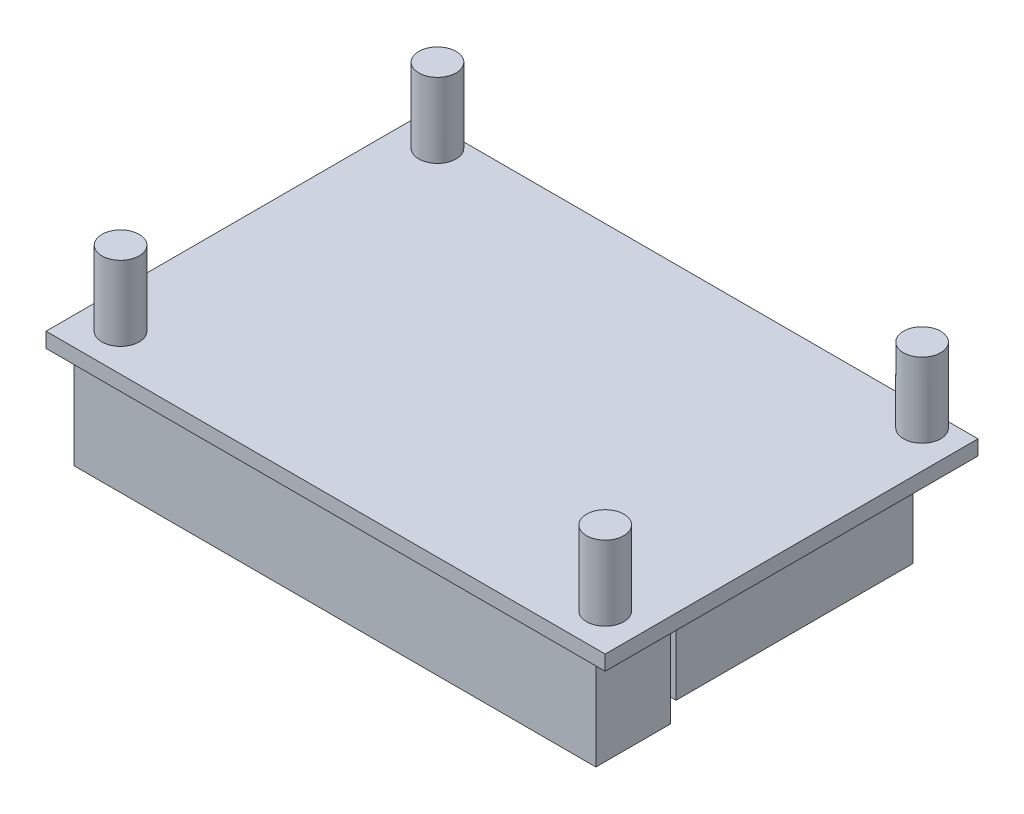
ISO-10303-21;
HEADER;
FILE_DESCRIPTION(('STEP AP214'),'2;1');
FILE_NAME('part.step','',(''),(''),'','','');
FILE_SCHEMA(('AUTOMOTIVE_DESIGN { 1 0 10303 214 1 1 1 1 }'));
ENDSEC;
DATA;
#1=APPLICATION_CONTEXT('core data for automotive mechanical design processes');
#2=APPLICATION_PROTOCOL_DEFINITION('international standard','automotive_design',2000,#1);
#3=PRODUCT_CONTEXT('',#1,'mechanical');
#4=PRODUCT('Part','Part','',(#3));
#5=PRODUCT_RELATED_PRODUCT_CATEGORY('part','',(#4));
#6=PRODUCT_DEFINITION_FORMATION('','',#4);
#7=PRODUCT_DEFINITION_CONTEXT('part definition',#1,'design');
#8=PRODUCT_DEFINITION('design','',#6,#7);
#9=PRODUCT_DEFINITION_SHAPE('','',#8);
#10=(LENGTH_UNIT() NAMED_UNIT(*) SI_UNIT(.MILLI.,.METRE.));
#11=(NAMED_UNIT(*) PLANE_ANGLE_UNIT() SI_UNIT($,.RADIAN.));
#12=(NAMED_UNIT(*) SI_UNIT($,.STERADIAN.) SOLID_ANGLE_UNIT());
#13=UNCERTAINTY_MEASURE_WITH_UNIT(LENGTH_MEASURE(1.E-05),#10,'distance_accuracy_value','');
#14=(GEOMETRIC_REPRESENTATION_CONTEXT(3) GLOBAL_UNCERTAINTY_ASSIGNED_CONTEXT((#13)) GLOBAL_UNIT_ASSIGNED_CONTEXT((#10,
#11,#12)) REPRESENTATION_CONTEXT('',''));
#15=CARTESIAN_POINT('',(0.,0.,0.));
#16=DIRECTION('',(0.,0.,1.));
#17=DIRECTION('',(1.,0.,0.));
#18=AXIS2_PLACEMENT_3D('',#15,#16,#17);
#19=CARTESIAN_POINT('',(0.,12.7,0.));
#20=DIRECTION('',(0.,1.,0.));
#21=DIRECTION('',(0.,0.,1.));
#22=AXIS2_PLACEMENT_3D('',#19,#20,#21);
#23=PLANE('',#22);
#24=DIRECTION('',(0.,0.,1.));
#25=VECTOR('',#24,1.);
#26=CARTESIAN_POINT('',(1.6,12.7,-16.));
#27=LINE('',#26,#25);
#28=CARTESIAN_POINT('',(1.6,12.7,-16.));
#29=VERTEX_POINT('',#28);
#30=CARTESIAN_POINT('',(1.6,12.7,9.4));
#31=VERTEX_POINT('',#30);
#32=EDGE_CURVE('E218',#29,#31,#27,.T.);
#33=ORIENTED_EDGE('',*,*,#32,.T.);
#34=DIRECTION('',(1.,0.,0.));
#35=VECTOR('',#34,1.);
#36=CARTESIAN_POINT('',(1.6,12.7,9.4));
#37=LINE('',#36,#35);
#38=CARTESIAN_POINT('',(27.,12.7,9.4));
#39=VERTEX_POINT('',#38);
#40=EDGE_CURVE('E222',#31,#39,#37,.T.);
#41=ORIENTED_EDGE('',*,*,#40,.T.);
#42=DIRECTION('',(0.,0.,-1.));
#43=VECTOR('',#42,1.);
#44=CARTESIAN_POINT('',(27.,12.7,9.4));
#45=LINE('',#44,#43);
#46=CARTESIAN_POINT('',(27.,12.7,-16.));
#47=VERTEX_POINT('',#46);
#48=EDGE_CURVE('E221',#39,#47,#45,.T.);
#49=ORIENTED_EDGE('',*,*,#48,.T.);
#50=DIRECTION('',(-1.,0.,0.));
#51=VECTOR('',#50,1.);
#52=CARTESIAN_POINT('',(27.,12.7,-16.));
#53=LINE('',#52,#51);
#54=EDGE_CURVE('E228',#47,#29,#53,.T.);
#55=ORIENTED_EDGE('',*,*,#54,.T.);
#56=EDGE_LOOP('',(#33,#41,#49,#55));
#57=FACE_BOUND('',#56,.T.);
#58=DIRECTION('',(-1.,0.,0.));
#59=VECTOR('',#58,1.);
#60=CARTESIAN_POINT('',(-5.1,12.7,-16.));
#61=LINE('',#60,#59);
#62=CARTESIAN_POINT('',(-5.1,12.7,-16.));
#63=VERTEX_POINT('',#62);
#64=CARTESIAN_POINT('',(-28.,12.7,-16.));
#65=VERTEX_POINT('',#64);
#66=EDGE_CURVE('E292',#63,#65,#61,.T.);
#67=ORIENTED_EDGE('',*,*,#66,.T.);
#68=DIRECTION('',(0.,0.,1.));
#69=VECTOR('',#68,1.);
#70=CARTESIAN_POINT('',(-28.,12.7,-16.));
#71=LINE('',#70,#69);
#72=CARTESIAN_POINT('',(-28.,12.7,7.));
#73=VERTEX_POINT('',#72);
#74=EDGE_CURVE('E283',#65,#73,#71,.T.);
#75=ORIENTED_EDGE('',*,*,#74,.T.);
#76=DIRECTION('',(1.,0.,0.));
#77=VECTOR('',#76,1.);
#78=CARTESIAN_POINT('',(-28.,12.7,7.));
#79=LINE('',#78,#77);
#80=CARTESIAN_POINT('',(-5.1,12.7,7.));
#81=VERTEX_POINT('',#80);
#82=EDGE_CURVE('E285',#73,#81,#79,.T.);
#83=ORIENTED_EDGE('',*,*,#82,.T.);
#84=DIRECTION('',(0.,0.,-1.));
#85=VECTOR('',#84,1.);
#86=CARTESIAN_POINT('',(-5.1,12.7,7.));
#87=LINE('',#86,#85);
#88=EDGE_CURVE('E288',#81,#63,#87,.T.);
#89=ORIENTED_EDGE('',*,*,#88,.T.);
#90=EDGE_LOOP('',(#67,#75,#83,#89));
#91=FACE_BOUND('',#90,.T.);
#92=DIRECTION('',(0.,0.,1.));
#93=VECTOR('',#92,1.);
#94=CARTESIAN_POINT('',(-30.,12.7,-20.));
#95=LINE('',#94,#93);
#96=CARTESIAN_POINT('',(-30.,12.7,-20.));
#97=VERTEX_POINT('',#96);
#98=CARTESIAN_POINT('',(-30.,12.7,20.));
#99=VERTEX_POINT('',#98);
#100=EDGE_CURVE('E327',#97,#99,#95,.T.);
#101=ORIENTED_EDGE('',*,*,#100,.F.);
#102=DIRECTION('',(-1.,0.,0.));
#103=VECTOR('',#102,1.);
#104=CARTESIAN_POINT('',(30.,12.7,-20.));
#105=LINE('',#104,#103);
#106=CARTESIAN_POINT('',(30.,12.7,-20.));
#107=VERTEX_POINT('',#106);
#108=EDGE_CURVE('E333',#107,#97,#105,.T.);
#109=ORIENTED_EDGE('',*,*,#108,.F.);
#110=DIRECTION('',(0.,0.,-1.));
#111=VECTOR('',#110,1.);
#112=CARTESIAN_POINT('',(30.,12.7,20.));
#113=LINE('',#112,#111);
#114=CARTESIAN_POINT('',(30.,12.7,20.));
#115=VERTEX_POINT('',#114);
#116=EDGE_CURVE('E349',#115,#107,#113,.T.);
#117=ORIENTED_EDGE('',*,*,#116,.F.);
#118=DIRECTION('',(1.,0.,0.));
#119=VECTOR('',#118,1.);
#120=CARTESIAN_POINT('',(-30.,12.7,20.));
#121=LINE('',#120,#119);
#122=EDGE_CURVE('E350',#99,#115,#121,.T.);
#123=ORIENTED_EDGE('',*,*,#122,.F.);
#124=EDGE_LOOP('',(#101,#109,#117,#123));
#125=FACE_BOUND('',#124,.T.);
#126=DIRECTION('',(0.,0.,1.));
#127=VECTOR('',#126,1.);
#128=CARTESIAN_POINT('',(-28.,12.7,11.));
#129=LINE('',#128,#127);
#130=CARTESIAN_POINT('',(-28.,12.7,11.));
#131=VERTEX_POINT('',#130);
#132=CARTESIAN_POINT('',(-28.,12.7,19.));
#133=VERTEX_POINT('',#132);
#134=EDGE_CURVE('E59',#131,#133,#129,.T.);
#135=ORIENTED_EDGE('',*,*,#134,.T.);
#136=DIRECTION('',(1.,0.,0.));
#137=VECTOR('',#136,1.);
#138=CARTESIAN_POINT('',(-28.,12.7,19.));
#139=LINE('',#138,#137);
#140=CARTESIAN_POINT('',(28.,12.7,19.));
#141=VERTEX_POINT('',#140);
#142=EDGE_CURVE('E64',#133,#141,#139,.T.);
#143=ORIENTED_EDGE('',*,*,#142,.T.);
#144=DIRECTION('',(0.,0.,-1.));
#145=VECTOR('',#144,1.);
#146=CARTESIAN_POINT('',(28.,12.7,19.));
#147=LINE('',#146,#145);
#148=CARTESIAN_POINT('',(28.,12.7,11.));
#149=VERTEX_POINT('',#148);
#150=EDGE_CURVE('E185',#141,#149,#147,.T.);
#151=ORIENTED_EDGE('',*,*,#150,.T.);
#152=DIRECTION('',(-1.,0.,0.));
#153=VECTOR('',#152,1.);
#154=CARTESIAN_POINT('',(28.,12.7,11.));
#155=LINE('',#154,#153);
#156=EDGE_CURVE('E183',#149,#131,#155,.T.);
#157=ORIENTED_EDGE('',*,*,#156,.T.);
#158=EDGE_LOOP('',(#135,#143,#151,#157));
#159=FACE_BOUND('',#158,.T.);
#160=ADVANCED_FACE('F43',(#57,#91,#125,#159),#23,.F.);
#161=CARTESIAN_POINT('',(-26.,22.3,-18.));
#162=DIRECTION('',(0.,-1.,0.));
#163=DIRECTION('',(0.,0.,-1.));
#164=AXIS2_PLACEMENT_3D('',#161,#162,#163);
#165=CYLINDRICAL_SURFACE('',#164,2.);
#166=CARTESIAN_POINT('',(-26.,22.3,-18.));
#167=DIRECTION('',(0.,1.,0.));
#168=DIRECTION('',(0.,0.,1.));
#169=AXIS2_PLACEMENT_3D('',#166,#167,#168);
#170=CIRCLE('',#169,2.);
#171=CARTESIAN_POINT('',(-26.,22.3,-16.));
#172=VERTEX_POINT('',#171);
#173=EDGE_CURVE('E11',#172,#172,#170,.T.);
#174=ORIENTED_EDGE('',*,*,#173,.F.);
#175=EDGE_LOOP('',(#174));
#176=FACE_BOUND('',#175,.T.);
#177=CARTESIAN_POINT('',(-26.,14.3,-18.));
#178=DIRECTION('',(0.,1.,0.));
#179=DIRECTION('',(0.,0.,1.));
#180=AXIS2_PLACEMENT_3D('',#177,#178,#179);
#181=CIRCLE('',#180,2.);
#182=CARTESIAN_POINT('',(-26.,14.3,-20.));
#183=VERTEX_POINT('',#182);
#184=EDGE_CURVE('E50',#183,#183,#181,.T.);
#185=ORIENTED_EDGE('',*,*,#184,.T.);
#186=EDGE_LOOP('',(#185));
#187=FACE_BOUND('',#186,.T.);
#188=ADVANCED_FACE('F44',(#176,#187),#165,.T.);
#189=CARTESIAN_POINT('',(-26.,22.3,-18.));
#190=DIRECTION('',(0.,1.,0.));
#191=DIRECTION('',(0.,0.,1.));
#192=AXIS2_PLACEMENT_3D('',#189,#190,#191);
#193=PLANE('',#192);
#194=ORIENTED_EDGE('',*,*,#173,.T.);
#195=EDGE_LOOP('',(#194));
#196=FACE_BOUND('',#195,.T.);
#197=ADVANCED_FACE('F391',(#196),#193,.T.);
#198=CARTESIAN_POINT('',(0.,14.3,0.));
#199=DIRECTION('',(0.,1.,0.));
#200=DIRECTION('',(0.,0.,1.));
#201=AXIS2_PLACEMENT_3D('',#198,#199,#200);
#202=PLANE('',#201);
#203=CARTESIAN_POINT('',(26.,14.3,16.));
#204=DIRECTION('',(0.,1.,0.));
#205=DIRECTION('',(0.,0.,1.));
#206=AXIS2_PLACEMENT_3D('',#203,#204,#205);
#207=CIRCLE('',#206,2.);
#208=CARTESIAN_POINT('',(26.,14.3,18.));
#209=VERTEX_POINT('',#208);
#210=EDGE_CURVE('E311',#209,#209,#207,.T.);
#211=ORIENTED_EDGE('',*,*,#210,.F.);
#212=EDGE_LOOP('',(#211));
#213=FACE_BOUND('',#212,.T.);
#214=CARTESIAN_POINT('',(-26.,14.3,16.));
#215=DIRECTION('',(0.,1.,0.));
#216=DIRECTION('',(0.,0.,1.));
#217=AXIS2_PLACEMENT_3D('',#214,#215,#216);
#218=CIRCLE('',#217,2.);
#219=CARTESIAN_POINT('',(-26.,14.3,18.));
#220=VERTEX_POINT('',#219);
#221=EDGE_CURVE('E323',#220,#220,#218,.T.);
#222=ORIENTED_EDGE('',*,*,#221,.F.);
#223=EDGE_LOOP('',(#222));
#224=FACE_BOUND('',#223,.T.);
#225=DIRECTION('',(-1.,0.,0.));
#226=VECTOR('',#225,1.);
#227=CARTESIAN_POINT('',(30.,14.3,-20.));
#228=LINE('',#227,#226);
#229=CARTESIAN_POINT('',(30.,14.3,-20.));
#230=VERTEX_POINT('',#229);
#231=CARTESIAN_POINT('',(26.,14.3,-20.));
#232=VERTEX_POINT('',#231);
#233=EDGE_CURVE('E336',#230,#232,#228,.T.);
#234=ORIENTED_EDGE('',*,*,#233,.T.);
#235=CARTESIAN_POINT('',(26.,14.3,-18.));
#236=DIRECTION('',(0.,1.,0.));
#237=DIRECTION('',(0.,0.,1.));
#238=AXIS2_PLACEMENT_3D('',#235,#236,#237);
#239=CIRCLE('',#238,2.);
#240=EDGE_CURVE('E320',#232,#232,#239,.T.);
#241=ORIENTED_EDGE('',*,*,#240,.F.);
#242=EDGE_CURVE('E344',#232,#183,#228,.T.);
#243=ORIENTED_EDGE('',*,*,#242,.T.);
#244=ORIENTED_EDGE('',*,*,#184,.F.);
#245=CARTESIAN_POINT('',(-30.,14.3,-20.));
#246=VERTEX_POINT('',#245);
#247=EDGE_CURVE('E340',#183,#246,#228,.T.);
#248=ORIENTED_EDGE('',*,*,#247,.T.);
#249=DIRECTION('',(0.,0.,1.));
#250=VECTOR('',#249,1.);
#251=CARTESIAN_POINT('',(-30.,14.3,-20.));
#252=LINE('',#251,#250);
#253=CARTESIAN_POINT('',(-30.,14.3,20.));
#254=VERTEX_POINT('',#253);
#255=EDGE_CURVE('E332',#246,#254,#252,.T.);
#256=ORIENTED_EDGE('',*,*,#255,.T.);
#257=DIRECTION('',(1.,0.,0.));
#258=VECTOR('',#257,1.);
#259=CARTESIAN_POINT('',(-30.,14.3,20.));
#260=LINE('',#259,#258);
#261=CARTESIAN_POINT('',(30.,14.3,20.));
#262=VERTEX_POINT('',#261);
#263=EDGE_CURVE('E331',#254,#262,#260,.T.);
#264=ORIENTED_EDGE('',*,*,#263,.T.);
#265=DIRECTION('',(0.,0.,-1.));
#266=VECTOR('',#265,1.);
#267=CARTESIAN_POINT('',(30.,14.3,20.));
#268=LINE('',#267,#266);
#269=EDGE_CURVE('E339',#262,#230,#268,.T.);
#270=ORIENTED_EDGE('',*,*,#269,.T.);
#271=EDGE_LOOP('',(#234,#241,#243,#244,#248,#256,#264,#270));
#272=FACE_BOUND('',#271,.T.);
#273=ADVANCED_FACE('F366',(#213,#224,#272),#202,.T.);
#274=CARTESIAN_POINT('',(-30.,14.3,-20.));
#275=DIRECTION('',(1.,0.,0.));
#276=DIRECTION('',(0.,0.,-1.));
#277=AXIS2_PLACEMENT_3D('',#274,#275,#276);
#278=PLANE('',#277);
#279=ORIENTED_EDGE('',*,*,#100,.T.);
#280=DIRECTION('',(0.,-1.,0.));
#281=VECTOR('',#280,1.);
#282=CARTESIAN_POINT('',(-30.,14.3,20.));
#283=LINE('',#282,#281);
#284=EDGE_CURVE('E356',#254,#99,#283,.T.);
#285=ORIENTED_EDGE('',*,*,#284,.F.);
#286=ORIENTED_EDGE('',*,*,#255,.F.);
#287=DIRECTION('',(0.,-1.,0.));
#288=VECTOR('',#287,1.);
#289=CARTESIAN_POINT('',(-30.,14.3,-20.));
#290=LINE('',#289,#288);
#291=EDGE_CURVE('E343',#246,#97,#290,.T.);
#292=ORIENTED_EDGE('',*,*,#291,.T.);
#293=EDGE_LOOP('',(#279,#285,#286,#292));
#294=FACE_BOUND('',#293,.T.);
#295=ADVANCED_FACE('F379',(#294),#278,.F.);
#296=CARTESIAN_POINT('',(-30.,14.3,20.));
#297=DIRECTION('',(0.,0.,-1.));
#298=DIRECTION('',(-1.,0.,0.));
#299=AXIS2_PLACEMENT_3D('',#296,#297,#298);
#300=PLANE('',#299);
#301=ORIENTED_EDGE('',*,*,#122,.T.);
#302=DIRECTION('',(0.,-1.,0.));
#303=VECTOR('',#302,1.);
#304=CARTESIAN_POINT('',(30.,14.3,20.));
#305=LINE('',#304,#303);
#306=EDGE_CURVE('E360',#262,#115,#305,.T.);
#307=ORIENTED_EDGE('',*,*,#306,.F.);
#308=ORIENTED_EDGE('',*,*,#263,.F.);
#309=ORIENTED_EDGE('',*,*,#284,.T.);
#310=EDGE_LOOP('',(#301,#307,#308,#309));
#311=FACE_BOUND('',#310,.T.);
#312=ADVANCED_FACE('F383',(#311),#300,.F.);
#313=CARTESIAN_POINT('',(30.,14.3,20.));
#314=DIRECTION('',(-1.,0.,0.));
#315=DIRECTION('',(0.,0.,1.));
#316=AXIS2_PLACEMENT_3D('',#313,#314,#315);
#317=PLANE('',#316);
#318=ORIENTED_EDGE('',*,*,#116,.T.);
#319=DIRECTION('',(0.,-1.,0.));
#320=VECTOR('',#319,1.);
#321=CARTESIAN_POINT('',(30.,14.3,-20.));
#322=LINE('',#321,#320);
#323=EDGE_CURVE('E355',#230,#107,#322,.T.);
#324=ORIENTED_EDGE('',*,*,#323,.F.);
#325=ORIENTED_EDGE('',*,*,#269,.F.);
#326=ORIENTED_EDGE('',*,*,#306,.T.);
#327=EDGE_LOOP('',(#318,#324,#325,#326));
#328=FACE_BOUND('',#327,.T.);
#329=ADVANCED_FACE('F390',(#328),#317,.F.);
#330=CARTESIAN_POINT('',(30.,14.3,-20.));
#331=DIRECTION('',(0.,0.,1.));
#332=DIRECTION('',(1.,0.,0.));
#333=AXIS2_PLACEMENT_3D('',#330,#331,#332);
#334=PLANE('',#333);
#335=ORIENTED_EDGE('',*,*,#108,.T.);
#336=ORIENTED_EDGE('',*,*,#291,.F.);
#337=ORIENTED_EDGE('',*,*,#247,.F.);
#338=ORIENTED_EDGE('',*,*,#242,.F.);
#339=ORIENTED_EDGE('',*,*,#233,.F.);
#340=ORIENTED_EDGE('',*,*,#323,.T.);
#341=EDGE_LOOP('',(#335,#336,#337,#338,#339,#340));
#342=FACE_BOUND('',#341,.T.);
#343=ADVANCED_FACE('F374',(#342),#334,.F.);
#344=CARTESIAN_POINT('',(-26.,22.3,16.));
#345=DIRECTION('',(0.,-1.,0.));
#346=DIRECTION('',(0.,0.,-1.));
#347=AXIS2_PLACEMENT_3D('',#344,#345,#346);
#348=CYLINDRICAL_SURFACE('',#347,2.);
#349=CARTESIAN_POINT('',(-26.,22.3,16.));
#350=DIRECTION('',(0.,1.,0.));
#351=DIRECTION('',(0.,0.,1.));
#352=AXIS2_PLACEMENT_3D('',#349,#350,#351);
#353=CIRCLE('',#352,2.);
#354=CARTESIAN_POINT('',(-26.,22.3,18.));
#355=VERTEX_POINT('',#354);
#356=EDGE_CURVE('E324',#355,#355,#353,.T.);
#357=ORIENTED_EDGE('',*,*,#356,.F.);
#358=EDGE_LOOP('',(#357));
#359=FACE_BOUND('',#358,.T.);
#360=ORIENTED_EDGE('',*,*,#221,.T.);
#361=EDGE_LOOP('',(#360));
#362=FACE_BOUND('',#361,.T.);
#363=ADVANCED_FACE('F401',(#359,#362),#348,.T.);
#364=CARTESIAN_POINT('',(-26.,22.3,16.));
#365=DIRECTION('',(0.,1.,0.));
#366=DIRECTION('',(0.,0.,1.));
#367=AXIS2_PLACEMENT_3D('',#364,#365,#366);
#368=PLANE('',#367);
#369=ORIENTED_EDGE('',*,*,#356,.T.);
#370=EDGE_LOOP('',(#369));
#371=FACE_BOUND('',#370,.T.);
#372=ADVANCED_FACE('F421',(#371),#368,.T.);
#373=CARTESIAN_POINT('',(26.,22.3,-18.));
#374=DIRECTION('',(0.,-1.,0.));
#375=DIRECTION('',(0.,0.,-1.));
#376=AXIS2_PLACEMENT_3D('',#373,#374,#375);
#377=CYLINDRICAL_SURFACE('',#376,2.);
#378=CARTESIAN_POINT('',(26.,22.3,-18.));
#379=DIRECTION('',(0.,1.,0.));
#380=DIRECTION('',(0.,0.,1.));
#381=AXIS2_PLACEMENT_3D('',#378,#379,#380);
#382=CIRCLE('',#381,2.);
#383=CARTESIAN_POINT('',(26.,22.3,-16.));
#384=VERTEX_POINT('',#383);
#385=EDGE_CURVE('E319',#384,#384,#382,.T.);
#386=ORIENTED_EDGE('',*,*,#385,.F.);
#387=EDGE_LOOP('',(#386));
#388=FACE_BOUND('',#387,.T.);
#389=ORIENTED_EDGE('',*,*,#240,.T.);
#390=EDGE_LOOP('',(#389));
#391=FACE_BOUND('',#390,.T.);
#392=ADVANCED_FACE('F428',(#388,#391),#377,.T.);
#393=CARTESIAN_POINT('',(26.,22.3,-18.));
#394=DIRECTION('',(0.,1.,0.));
#395=DIRECTION('',(0.,0.,1.));
#396=AXIS2_PLACEMENT_3D('',#393,#394,#395);
#397=PLANE('',#396);
#398=ORIENTED_EDGE('',*,*,#385,.T.);
#399=EDGE_LOOP('',(#398));
#400=FACE_BOUND('',#399,.T.);
#401=ADVANCED_FACE('F434',(#400),#397,.T.);
#402=CARTESIAN_POINT('',(26.,22.3,16.));
#403=DIRECTION('',(0.,-1.,0.));
#404=DIRECTION('',(0.,0.,-1.));
#405=AXIS2_PLACEMENT_3D('',#402,#403,#404);
#406=CYLINDRICAL_SURFACE('',#405,2.);
#407=CARTESIAN_POINT('',(26.,22.3,16.));
#408=DIRECTION('',(0.,1.,0.));
#409=DIRECTION('',(0.,0.,1.));
#410=AXIS2_PLACEMENT_3D('',#407,#408,#409);
#411=CIRCLE('',#410,2.);
#412=CARTESIAN_POINT('',(26.,22.3,18.));
#413=VERTEX_POINT('',#412);
#414=EDGE_CURVE('E314',#413,#413,#411,.T.);
#415=ORIENTED_EDGE('',*,*,#414,.F.);
#416=EDGE_LOOP('',(#415));
#417=FACE_BOUND('',#416,.T.);
#418=ORIENTED_EDGE('',*,*,#210,.T.);
#419=EDGE_LOOP('',(#418));
#420=FACE_BOUND('',#419,.T.);
#421=ADVANCED_FACE('F438',(#417,#420),#406,.T.);
#422=CARTESIAN_POINT('',(26.,22.3,16.));
#423=DIRECTION('',(0.,1.,0.));
#424=DIRECTION('',(0.,0.,1.));
#425=AXIS2_PLACEMENT_3D('',#422,#423,#424);
#426=PLANE('',#425);
#427=ORIENTED_EDGE('',*,*,#414,.T.);
#428=EDGE_LOOP('',(#427));
#429=FACE_BOUND('',#428,.T.);
#430=ADVANCED_FACE('F444',(#429),#426,.T.);
#431=CARTESIAN_POINT('',(-28.,12.7,-16.));
#432=DIRECTION('',(1.,0.,0.));
#433=DIRECTION('',(0.,0.,-1.));
#434=AXIS2_PLACEMENT_3D('',#431,#432,#433);
#435=PLANE('',#434);
#436=DIRECTION('',(0.,0.,1.));
#437=VECTOR('',#436,1.);
#438=CARTESIAN_POINT('',(-28.,10.,-16.));
#439=LINE('',#438,#437);
#440=CARTESIAN_POINT('',(-28.,10.,-16.));
#441=VERTEX_POINT('',#440);
#442=CARTESIAN_POINT('',(-28.,10.,7.));
#443=VERTEX_POINT('',#442);
#444=EDGE_CURVE('E278',#441,#443,#439,.T.);
#445=ORIENTED_EDGE('',*,*,#444,.T.);
#446=DIRECTION('',(0.,-1.,0.));
#447=VECTOR('',#446,1.);
#448=CARTESIAN_POINT('',(-28.,12.7,7.));
#449=LINE('',#448,#447);
#450=EDGE_CURVE('E309',#73,#443,#449,.T.);
#451=ORIENTED_EDGE('',*,*,#450,.F.);
#452=ORIENTED_EDGE('',*,*,#74,.F.);
#453=DIRECTION('',(0.,-1.,0.));
#454=VECTOR('',#453,1.);
#455=CARTESIAN_POINT('',(-28.,12.7,-16.));
#456=LINE('',#455,#454);
#457=EDGE_CURVE('E294',#65,#441,#456,.T.);
#458=ORIENTED_EDGE('',*,*,#457,.T.);
#459=EDGE_LOOP('',(#445,#451,#452,#458));
#460=FACE_BOUND('',#459,.T.);
#461=ADVANCED_FACE('F449',(#460),#435,.F.);
#462=CARTESIAN_POINT('',(-28.,12.7,7.));
#463=DIRECTION('',(0.,0.,-1.));
#464=DIRECTION('',(-1.,0.,0.));
#465=AXIS2_PLACEMENT_3D('',#462,#463,#464);
#466=PLANE('',#465);
#467=DIRECTION('',(1.,0.,0.));
#468=VECTOR('',#467,1.);
#469=CARTESIAN_POINT('',(-28.,10.,7.));
#470=LINE('',#469,#468);
#471=CARTESIAN_POINT('',(-5.1,10.,7.));
#472=VERTEX_POINT('',#471);
#473=EDGE_CURVE('E299',#443,#472,#470,.T.);
#474=ORIENTED_EDGE('',*,*,#473,.T.);
#475=DIRECTION('',(0.,-1.,0.));
#476=VECTOR('',#475,1.);
#477=CARTESIAN_POINT('',(-5.1,12.7,7.));
#478=LINE('',#477,#476);
#479=EDGE_CURVE('E307',#81,#472,#478,.T.);
#480=ORIENTED_EDGE('',*,*,#479,.F.);
#481=ORIENTED_EDGE('',*,*,#82,.F.);
#482=ORIENTED_EDGE('',*,*,#450,.T.);
#483=EDGE_LOOP('',(#474,#480,#481,#482));
#484=FACE_BOUND('',#483,.T.);
#485=ADVANCED_FACE('F452',(#484),#466,.F.);
#486=CARTESIAN_POINT('',(-5.1,12.7,7.));
#487=DIRECTION('',(-1.,0.,0.));
#488=DIRECTION('',(0.,0.,1.));
#489=AXIS2_PLACEMENT_3D('',#486,#487,#488);
#490=PLANE('',#489);
#491=DIRECTION('',(0.,0.,-1.));
#492=VECTOR('',#491,1.);
#493=CARTESIAN_POINT('',(-5.1,10.,7.));
#494=LINE('',#493,#492);
#495=CARTESIAN_POINT('',(-5.1,10.,-16.));
#496=VERTEX_POINT('',#495);
#497=EDGE_CURVE('E300',#472,#496,#494,.T.);
#498=ORIENTED_EDGE('',*,*,#497,.T.);
#499=DIRECTION('',(0.,-1.,0.));
#500=VECTOR('',#499,1.);
#501=CARTESIAN_POINT('',(-5.1,12.7,-16.));
#502=LINE('',#501,#500);
#503=EDGE_CURVE('E304',#63,#496,#502,.T.);
#504=ORIENTED_EDGE('',*,*,#503,.F.);
#505=ORIENTED_EDGE('',*,*,#88,.F.);
#506=ORIENTED_EDGE('',*,*,#479,.T.);
#507=EDGE_LOOP('',(#498,#504,#505,#506));
#508=FACE_BOUND('',#507,.T.);
#509=ADVANCED_FACE('F451',(#508),#490,.F.);
#510=CARTESIAN_POINT('',(-5.1,12.7,-16.));
#511=DIRECTION('',(0.,0.,1.));
#512=DIRECTION('',(1.,0.,0.));
#513=AXIS2_PLACEMENT_3D('',#510,#511,#512);
#514=PLANE('',#513);
#515=DIRECTION('',(-1.,0.,0.));
#516=VECTOR('',#515,1.);
#517=CARTESIAN_POINT('',(-5.1,10.,-16.));
#518=LINE('',#517,#516);
#519=EDGE_CURVE('E281',#496,#441,#518,.T.);
#520=ORIENTED_EDGE('',*,*,#519,.T.);
#521=ORIENTED_EDGE('',*,*,#457,.F.);
#522=ORIENTED_EDGE('',*,*,#66,.F.);
#523=ORIENTED_EDGE('',*,*,#503,.T.);
#524=EDGE_LOOP('',(#520,#521,#522,#523));
#525=FACE_BOUND('',#524,.T.);
#526=ADVANCED_FACE('F459',(#525),#514,.F.);
#527=CARTESIAN_POINT('',(0.,10.,0.));
#528=DIRECTION('',(0.,1.,0.));
#529=DIRECTION('',(0.,0.,1.));
#530=AXIS2_PLACEMENT_3D('',#527,#528,#529);
#531=PLANE('',#530);
#532=DIRECTION('',(-1.,0.,0.));
#533=VECTOR('',#532,1.);
#534=CARTESIAN_POINT('',(-15.,10.,-14.));
#535=LINE('',#534,#533);
#536=CARTESIAN_POINT('',(-15.,10.,-14.));
#537=VERTEX_POINT('',#536);
#538=CARTESIAN_POINT('',(-25.,10.,-14.));
#539=VERTEX_POINT('',#538);
#540=EDGE_CURVE('E256',#537,#539,#535,.T.);
#541=ORIENTED_EDGE('',*,*,#540,.T.);
#542=DIRECTION('',(0.,0.,1.));
#543=VECTOR('',#542,1.);
#544=CARTESIAN_POINT('',(-25.,10.,-14.));
#545=LINE('',#544,#543);
#546=CARTESIAN_POINT('',(-25.,10.,-6.));
#547=VERTEX_POINT('',#546);
#548=EDGE_CURVE('E248',#539,#547,#545,.T.);
#549=ORIENTED_EDGE('',*,*,#548,.T.);
#550=DIRECTION('',(1.,0.,0.));
#551=VECTOR('',#550,1.);
#552=CARTESIAN_POINT('',(-25.,10.,-6.));
#553=LINE('',#552,#551);
#554=CARTESIAN_POINT('',(-15.,10.,-6.));
#555=VERTEX_POINT('',#554);
#556=EDGE_CURVE('E253',#547,#555,#553,.T.);
#557=ORIENTED_EDGE('',*,*,#556,.T.);
#558=DIRECTION('',(0.,0.,-1.));
#559=VECTOR('',#558,1.);
#560=CARTESIAN_POINT('',(-15.,10.,-6.));
#561=LINE('',#560,#559);
#562=EDGE_CURVE('E254',#555,#537,#561,.T.);
#563=ORIENTED_EDGE('',*,*,#562,.T.);
#564=EDGE_LOOP('',(#541,#549,#557,#563));
#565=FACE_BOUND('',#564,.T.);
#566=ORIENTED_EDGE('',*,*,#444,.F.);
#567=ORIENTED_EDGE('',*,*,#519,.F.);
#568=ORIENTED_EDGE('',*,*,#497,.F.);
#569=ORIENTED_EDGE('',*,*,#473,.F.);
#570=EDGE_LOOP('',(#566,#567,#568,#569));
#571=FACE_BOUND('',#570,.T.);
#572=ADVANCED_FACE('F462',(#565,#571),#531,.F.);
#573=CARTESIAN_POINT('',(-25.,10.,-14.));
#574=DIRECTION('',(1.,0.,0.));
#575=DIRECTION('',(0.,0.,-1.));
#576=AXIS2_PLACEMENT_3D('',#573,#574,#575);
#577=PLANE('',#576);
#578=DIRECTION('',(0.,0.,1.));
#579=VECTOR('',#578,1.);
#580=CARTESIAN_POINT('',(-25.,0.,-14.));
#581=LINE('',#580,#579);
#582=CARTESIAN_POINT('',(-25.,0.,-14.));
#583=VERTEX_POINT('',#582);
#584=CARTESIAN_POINT('',(-25.,0.,-6.));
#585=VERTEX_POINT('',#584);
#586=EDGE_CURVE('E250',#583,#585,#581,.T.);
#587=ORIENTED_EDGE('',*,*,#586,.T.);
#588=DIRECTION('',(0.,-1.,0.));
#589=VECTOR('',#588,1.);
#590=CARTESIAN_POINT('',(-25.,10.,-6.));
#591=LINE('',#590,#589);
#592=EDGE_CURVE('E280',#547,#585,#591,.T.);
#593=ORIENTED_EDGE('',*,*,#592,.F.);
#594=ORIENTED_EDGE('',*,*,#548,.F.);
#595=DIRECTION('',(0.,-1.,0.));
#596=VECTOR('',#595,1.);
#597=CARTESIAN_POINT('',(-25.,10.,-14.));
#598=LINE('',#597,#596);
#599=EDGE_CURVE('E261',#539,#583,#598,.T.);
#600=ORIENTED_EDGE('',*,*,#599,.T.);
#601=EDGE_LOOP('',(#587,#593,#594,#600));
#602=FACE_BOUND('',#601,.T.);
#603=ADVANCED_FACE('F470',(#602),#577,.F.);
#604=CARTESIAN_POINT('',(-25.,10.,-6.));
#605=DIRECTION('',(0.,0.,-1.));
#606=DIRECTION('',(-1.,0.,0.));
#607=AXIS2_PLACEMENT_3D('',#604,#605,#606);
#608=PLANE('',#607);
#609=DIRECTION('',(1.,0.,0.));
#610=VECTOR('',#609,1.);
#611=CARTESIAN_POINT('',(-25.,0.,-6.));
#612=LINE('',#611,#610);
#613=CARTESIAN_POINT('',(-15.,0.,-6.));
#614=VERTEX_POINT('',#613);
#615=EDGE_CURVE('E262',#585,#614,#612,.T.);
#616=ORIENTED_EDGE('',*,*,#615,.T.);
#617=DIRECTION('',(0.,-1.,0.));
#618=VECTOR('',#617,1.);
#619=CARTESIAN_POINT('',(-15.,10.,-6.));
#620=LINE('',#619,#618);
#621=EDGE_CURVE('E273',#555,#614,#620,.T.);
#622=ORIENTED_EDGE('',*,*,#621,.F.);
#623=ORIENTED_EDGE('',*,*,#556,.F.);
#624=ORIENTED_EDGE('',*,*,#592,.T.);
#625=EDGE_LOOP('',(#616,#622,#623,#624));
#626=FACE_BOUND('',#625,.T.);
#627=ADVANCED_FACE('F473',(#626),#608,.F.);
#628=CARTESIAN_POINT('',(-15.,10.,-6.));
#629=DIRECTION('',(-1.,0.,0.));
#630=DIRECTION('',(0.,0.,1.));
#631=AXIS2_PLACEMENT_3D('',#628,#629,#630);
#632=PLANE('',#631);
#633=DIRECTION('',(0.,0.,-1.));
#634=VECTOR('',#633,1.);
#635=CARTESIAN_POINT('',(-15.,0.,-6.));
#636=LINE('',#635,#634);
#637=CARTESIAN_POINT('',(-15.,0.,-14.));
#638=VERTEX_POINT('',#637);
#639=EDGE_CURVE('E266',#614,#638,#636,.T.);
#640=ORIENTED_EDGE('',*,*,#639,.T.);
#641=DIRECTION('',(0.,-1.,0.));
#642=VECTOR('',#641,1.);
#643=CARTESIAN_POINT('',(-15.,10.,-14.));
#644=LINE('',#643,#642);
#645=EDGE_CURVE('E271',#537,#638,#644,.T.);
#646=ORIENTED_EDGE('',*,*,#645,.F.);
#647=ORIENTED_EDGE('',*,*,#562,.F.);
#648=ORIENTED_EDGE('',*,*,#621,.T.);
#649=EDGE_LOOP('',(#640,#646,#647,#648));
#650=FACE_BOUND('',#649,.T.);
#651=ADVANCED_FACE('F474',(#650),#632,.F.);
#652=CARTESIAN_POINT('',(-15.,10.,-14.));
#653=DIRECTION('',(0.,0.,1.));
#654=DIRECTION('',(1.,0.,0.));
#655=AXIS2_PLACEMENT_3D('',#652,#653,#654);
#656=PLANE('',#655);
#657=DIRECTION('',(-1.,0.,0.));
#658=VECTOR('',#657,1.);
#659=CARTESIAN_POINT('',(-15.,0.,-14.));
#660=LINE('',#659,#658);
#661=EDGE_CURVE('E252',#638,#583,#660,.T.);
#662=ORIENTED_EDGE('',*,*,#661,.T.);
#663=ORIENTED_EDGE('',*,*,#599,.F.);
#664=ORIENTED_EDGE('',*,*,#540,.F.);
#665=ORIENTED_EDGE('',*,*,#645,.T.);
#666=EDGE_LOOP('',(#662,#663,#664,#665));
#667=FACE_BOUND('',#666,.T.);
#668=ADVANCED_FACE('F479',(#667),#656,.F.);
#669=CARTESIAN_POINT('',(0.,0.,0.));
#670=DIRECTION('',(0.,1.,0.));
#671=DIRECTION('',(0.,0.,1.));
#672=AXIS2_PLACEMENT_3D('',#669,#670,#671);
#673=PLANE('',#672);
#674=ORIENTED_EDGE('',*,*,#586,.F.);
#675=ORIENTED_EDGE('',*,*,#661,.F.);
#676=ORIENTED_EDGE('',*,*,#639,.F.);
#677=ORIENTED_EDGE('',*,*,#615,.F.);
#678=EDGE_LOOP('',(#674,#675,#676,#677));
#679=FACE_BOUND('',#678,.T.);
#680=ADVANCED_FACE('F483',(#679),#673,.F.);
#681=CARTESIAN_POINT('',(1.6,12.7,-16.));
#682=DIRECTION('',(1.,0.,0.));
#683=DIRECTION('',(0.,0.,-1.));
#684=AXIS2_PLACEMENT_3D('',#681,#682,#683);
#685=PLANE('',#684);
#686=DIRECTION('',(0.,0.,1.));
#687=VECTOR('',#686,1.);
#688=CARTESIAN_POINT('',(1.6,3.2,-16.));
#689=LINE('',#688,#687);
#690=CARTESIAN_POINT('',(1.6,3.2,-16.));
#691=VERTEX_POINT('',#690);
#692=CARTESIAN_POINT('',(1.6,3.2,9.4));
#693=VERTEX_POINT('',#692);
#694=EDGE_CURVE('E217',#691,#693,#689,.T.);
#695=ORIENTED_EDGE('',*,*,#694,.T.);
#696=DIRECTION('',(0.,-1.,0.));
#697=VECTOR('',#696,1.);
#698=CARTESIAN_POINT('',(1.6,12.7,9.4));
#699=LINE('',#698,#697);
#700=EDGE_CURVE('E245',#31,#693,#699,.T.);
#701=ORIENTED_EDGE('',*,*,#700,.F.);
#702=ORIENTED_EDGE('',*,*,#32,.F.);
#703=DIRECTION('',(0.,-1.,0.));
#704=VECTOR('',#703,1.);
#705=CARTESIAN_POINT('',(1.6,12.7,-16.));
#706=LINE('',#705,#704);
#707=EDGE_CURVE('E227',#29,#691,#706,.T.);
#708=ORIENTED_EDGE('',*,*,#707,.T.);
#709=EDGE_LOOP('',(#695,#701,#702,#708));
#710=FACE_BOUND('',#709,.T.);
#711=ADVANCED_FACE('F490',(#710),#685,.F.);
#712=CARTESIAN_POINT('',(1.6,12.7,9.4));
#713=DIRECTION('',(0.,0.,-1.));
#714=DIRECTION('',(-1.,0.,0.));
#715=AXIS2_PLACEMENT_3D('',#712,#713,#714);
#716=PLANE('',#715);
#717=DIRECTION('',(1.,0.,0.));
#718=VECTOR('',#717,1.);
#719=CARTESIAN_POINT('',(1.6,3.2,9.4));
#720=LINE('',#719,#718);
#721=CARTESIAN_POINT('',(27.,3.2,9.4));
#722=VERTEX_POINT('',#721);
#723=EDGE_CURVE('E232',#693,#722,#720,.T.);
#724=ORIENTED_EDGE('',*,*,#723,.T.);
#725=DIRECTION('',(0.,-1.,0.));
#726=VECTOR('',#725,1.);
#727=CARTESIAN_POINT('',(27.,12.7,9.4));
#728=LINE('',#727,#726);
#729=EDGE_CURVE('E243',#39,#722,#728,.T.);
#730=ORIENTED_EDGE('',*,*,#729,.F.);
#731=ORIENTED_EDGE('',*,*,#40,.F.);
#732=ORIENTED_EDGE('',*,*,#700,.T.);
#733=EDGE_LOOP('',(#724,#730,#731,#732));
#734=FACE_BOUND('',#733,.T.);
#735=ADVANCED_FACE('F491',(#734),#716,.F.);
#736=CARTESIAN_POINT('',(27.,12.7,9.4));
#737=DIRECTION('',(-1.,0.,0.));
#738=DIRECTION('',(0.,0.,1.));
#739=AXIS2_PLACEMENT_3D('',#736,#737,#738);
#740=PLANE('',#739);
#741=DIRECTION('',(0.,0.,-1.));
#742=VECTOR('',#741,1.);
#743=CARTESIAN_POINT('',(27.,3.2,9.4));
#744=LINE('',#743,#742);
#745=CARTESIAN_POINT('',(27.,3.2,-16.));
#746=VERTEX_POINT('',#745);
#747=EDGE_CURVE('E233',#722,#746,#744,.T.);
#748=ORIENTED_EDGE('',*,*,#747,.T.);
#749=DIRECTION('',(0.,-1.,0.));
#750=VECTOR('',#749,1.);
#751=CARTESIAN_POINT('',(27.,12.7,-16.));
#752=LINE('',#751,#750);
#753=EDGE_CURVE('E236',#47,#746,#752,.T.);
#754=ORIENTED_EDGE('',*,*,#753,.F.);
#755=ORIENTED_EDGE('',*,*,#48,.F.);
#756=ORIENTED_EDGE('',*,*,#729,.T.);
#757=EDGE_LOOP('',(#748,#754,#755,#756));
#758=FACE_BOUND('',#757,.T.);
#759=ADVANCED_FACE('F494',(#758),#740,.F.);
#760=CARTESIAN_POINT('',(27.,12.7,-16.));
#761=DIRECTION('',(0.,0.,1.));
#762=DIRECTION('',(1.,0.,0.));
#763=AXIS2_PLACEMENT_3D('',#760,#761,#762);
#764=PLANE('',#763);
#765=DIRECTION('',(-1.,0.,0.));
#766=VECTOR('',#765,1.);
#767=CARTESIAN_POINT('',(27.,3.2,-16.));
#768=LINE('',#767,#766);
#769=EDGE_CURVE('E225',#746,#691,#768,.T.);
#770=ORIENTED_EDGE('',*,*,#769,.T.);
#771=ORIENTED_EDGE('',*,*,#707,.F.);
#772=ORIENTED_EDGE('',*,*,#54,.F.);
#773=ORIENTED_EDGE('',*,*,#753,.T.);
#774=EDGE_LOOP('',(#770,#771,#772,#773));
#775=FACE_BOUND('',#774,.T.);
#776=ADVANCED_FACE('F496',(#775),#764,.F.);
#777=CARTESIAN_POINT('',(0.,3.2,0.));
#778=DIRECTION('',(0.,1.,0.));
#779=DIRECTION('',(0.,0.,1.));
#780=AXIS2_PLACEMENT_3D('',#777,#778,#779);
#781=PLANE('',#780);
#782=ORIENTED_EDGE('',*,*,#694,.F.);
#783=ORIENTED_EDGE('',*,*,#769,.F.);
#784=ORIENTED_EDGE('',*,*,#747,.F.);
#785=ORIENTED_EDGE('',*,*,#723,.F.);
#786=EDGE_LOOP('',(#782,#783,#784,#785));
#787=FACE_BOUND('',#786,.T.);
#788=ADVANCED_FACE('F502',(#787),#781,.F.);
#789=CARTESIAN_POINT('',(-28.,12.7,11.));
#790=DIRECTION('',(1.,0.,0.));
#791=DIRECTION('',(0.,0.,-1.));
#792=AXIS2_PLACEMENT_3D('',#789,#790,#791);
#793=PLANE('',#792);
#794=DIRECTION('',(0.,0.,1.));
#795=VECTOR('',#794,1.);
#796=CARTESIAN_POINT('',(-28.,2.3,11.));
#797=LINE('',#796,#795);
#798=CARTESIAN_POINT('',(-28.,2.3,11.));
#799=VERTEX_POINT('',#798);
#800=CARTESIAN_POINT('',(-28.,2.3,19.));
#801=VERTEX_POINT('',#800);
#802=EDGE_CURVE('E206',#799,#801,#797,.T.);
#803=ORIENTED_EDGE('',*,*,#802,.T.);
#804=DIRECTION('',(0.,-1.,0.));
#805=VECTOR('',#804,1.);
#806=CARTESIAN_POINT('',(-28.,12.7,19.));
#807=LINE('',#806,#805);
#808=EDGE_CURVE('E214',#133,#801,#807,.T.);
#809=ORIENTED_EDGE('',*,*,#808,.F.);
#810=ORIENTED_EDGE('',*,*,#134,.F.);
#811=DIRECTION('',(0.,-1.,0.));
#812=VECTOR('',#811,1.);
#813=CARTESIAN_POINT('',(-28.,12.7,11.));
#814=LINE('',#813,#812);
#815=EDGE_CURVE('E196',#131,#799,#814,.T.);
#816=ORIENTED_EDGE('',*,*,#815,.T.);
#817=EDGE_LOOP('',(#803,#809,#810,#816));
#818=FACE_BOUND('',#817,.T.);
#819=ADVANCED_FACE('F510',(#818),#793,.F.);
#820=CARTESIAN_POINT('',(-28.,12.7,19.));
#821=DIRECTION('',(0.,0.,-1.));
#822=DIRECTION('',(-1.,0.,0.));
#823=AXIS2_PLACEMENT_3D('',#820,#821,#822);
#824=PLANE('',#823);
#825=DIRECTION('',(1.,0.,0.));
#826=VECTOR('',#825,1.);
#827=CARTESIAN_POINT('',(-28.,2.3,19.));
#828=LINE('',#827,#826);
#829=CARTESIAN_POINT('',(28.,2.3,19.));
#830=VERTEX_POINT('',#829);
#831=EDGE_CURVE('E207',#801,#830,#828,.T.);
#832=ORIENTED_EDGE('',*,*,#831,.T.);
#833=DIRECTION('',(0.,-1.,0.));
#834=VECTOR('',#833,1.);
#835=CARTESIAN_POINT('',(28.,12.7,19.));
#836=LINE('',#835,#834);
#837=EDGE_CURVE('E197',#141,#830,#836,.T.);
#838=ORIENTED_EDGE('',*,*,#837,.F.);
#839=ORIENTED_EDGE('',*,*,#142,.F.);
#840=ORIENTED_EDGE('',*,*,#808,.T.);
#841=EDGE_LOOP('',(#832,#838,#839,#840));
#842=FACE_BOUND('',#841,.T.);
#843=ADVANCED_FACE('F512',(#842),#824,.F.);
#844=CARTESIAN_POINT('',(28.,12.7,19.));
#845=DIRECTION('',(-1.,0.,0.));
#846=DIRECTION('',(0.,0.,1.));
#847=AXIS2_PLACEMENT_3D('',#844,#845,#846);
#848=PLANE('',#847);
#849=DIRECTION('',(0.,0.,-1.));
#850=VECTOR('',#849,1.);
#851=CARTESIAN_POINT('',(28.,2.3,19.));
#852=LINE('',#851,#850);
#853=CARTESIAN_POINT('',(28.,2.3,11.));
#854=VERTEX_POINT('',#853);
#855=EDGE_CURVE('E194',#830,#854,#852,.T.);
#856=ORIENTED_EDGE('',*,*,#855,.T.);
#857=DIRECTION('',(0.,-1.,0.));
#858=VECTOR('',#857,1.);
#859=CARTESIAN_POINT('',(28.,12.7,11.));
#860=LINE('',#859,#858);
#861=EDGE_CURVE('E192',#149,#854,#860,.T.);
#862=ORIENTED_EDGE('',*,*,#861,.F.);
#863=ORIENTED_EDGE('',*,*,#150,.F.);
#864=ORIENTED_EDGE('',*,*,#837,.T.);
#865=EDGE_LOOP('',(#856,#862,#863,#864));
#866=FACE_BOUND('',#865,.T.);
#867=ADVANCED_FACE('F195',(#866),#848,.F.);
#868=CARTESIAN_POINT('',(28.,12.7,11.));
#869=DIRECTION('',(0.,0.,1.));
#870=DIRECTION('',(1.,0.,0.));
#871=AXIS2_PLACEMENT_3D('',#868,#869,#870);
#872=PLANE('',#871);
#873=DIRECTION('',(-1.,0.,0.));
#874=VECTOR('',#873,1.);
#875=CARTESIAN_POINT('',(28.,2.3,11.));
#876=LINE('',#875,#874);
#877=EDGE_CURVE('E215',#854,#799,#876,.T.);
#878=ORIENTED_EDGE('',*,*,#877,.T.);
#879=ORIENTED_EDGE('',*,*,#815,.F.);
#880=ORIENTED_EDGE('',*,*,#156,.F.);
#881=ORIENTED_EDGE('',*,*,#861,.T.);
#882=EDGE_LOOP('',(#878,#879,#880,#881));
#883=FACE_BOUND('',#882,.T.);
#884=ADVANCED_FACE('F199',(#883),#872,.F.);
#885=CARTESIAN_POINT('',(0.,2.3,0.));
#886=DIRECTION('',(0.,1.,0.));
#887=DIRECTION('',(0.,0.,1.));
#888=AXIS2_PLACEMENT_3D('',#885,#886,#887);
#889=PLANE('',#888);
#890=ORIENTED_EDGE('',*,*,#802,.F.);
#891=ORIENTED_EDGE('',*,*,#877,.F.);
#892=ORIENTED_EDGE('',*,*,#855,.F.);
#893=ORIENTED_EDGE('',*,*,#831,.F.);
#894=EDGE_LOOP('',(#890,#891,#892,#893));
#895=FACE_BOUND('',#894,.T.);
#896=ADVANCED_FACE('F516',(#895),#889,.F.);
#897=CLOSED_SHELL('',(#160,#188,#197,#273,#295,#312,#329,#343,#363,#372,#392,#401,#421,#430,
#461,#485,#509,#526,#572,#603,#627,#651,#668,#680,#711,#735,#759,#776,#788,#819,#843,#867,#884,#896));
#898=MANIFOLD_SOLID_BREP('B2',#897);
#899=ADVANCED_BREP_SHAPE_REPRESENTATION('',(#18,#898),#14);
#900=SHAPE_DEFINITION_REPRESENTATION(#9,#899);
ENDSEC;
END-ISO-10303-21;
